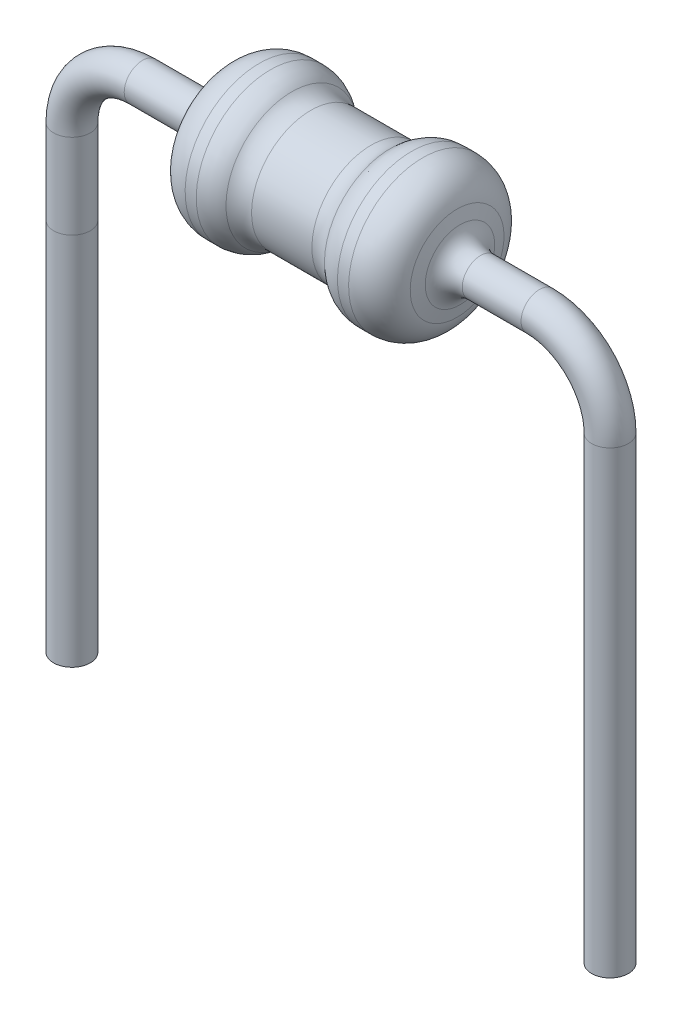
ISO-10303-21;
HEADER;
FILE_DESCRIPTION(('STEP AP214'),'2;1');
FILE_NAME('part.step','',(''),(''),'','','');
FILE_SCHEMA(('AUTOMOTIVE_DESIGN { 1 0 10303 214 1 1 1 1 }'));
ENDSEC;
DATA;
#1=APPLICATION_CONTEXT('core data for automotive mechanical design processes');
#2=APPLICATION_PROTOCOL_DEFINITION('international standard','automotive_design',2000,#1);
#3=PRODUCT_CONTEXT('',#1,'mechanical');
#4=PRODUCT('Part','Part','',(#3));
#5=PRODUCT_RELATED_PRODUCT_CATEGORY('part','',(#4));
#6=PRODUCT_DEFINITION_FORMATION('','',#4);
#7=PRODUCT_DEFINITION_CONTEXT('part definition',#1,'design');
#8=PRODUCT_DEFINITION('design','',#6,#7);
#9=PRODUCT_DEFINITION_SHAPE('','',#8);
#10=(LENGTH_UNIT() NAMED_UNIT(*) SI_UNIT(.MILLI.,.METRE.));
#11=(NAMED_UNIT(*) PLANE_ANGLE_UNIT() SI_UNIT($,.RADIAN.));
#12=(NAMED_UNIT(*) SI_UNIT($,.STERADIAN.) SOLID_ANGLE_UNIT());
#13=UNCERTAINTY_MEASURE_WITH_UNIT(LENGTH_MEASURE(1.E-05),#10,'distance_accuracy_value','');
#14=(GEOMETRIC_REPRESENTATION_CONTEXT(3) GLOBAL_UNCERTAINTY_ASSIGNED_CONTEXT((#13)) GLOBAL_UNIT_ASSIGNED_CONTEXT((#10,
#11,#12)) REPRESENTATION_CONTEXT('',''));
#15=CARTESIAN_POINT('',(0.,0.,0.));
#16=DIRECTION('',(0.,0.,1.));
#17=DIRECTION('',(1.,0.,0.));
#18=AXIS2_PLACEMENT_3D('',#15,#16,#17);
#19=CARTESIAN_POINT('',(-1.8,7.5,0.));
#20=DIRECTION('',(1.,0.,0.));
#21=DIRECTION('',(0.,1.,0.));
#22=AXIS2_PLACEMENT_3D('',#19,#20,#21);
#23=CONICAL_SURFACE('',#22,0.,1.34041265672804);
#24=CARTESIAN_POINT('',(-1.68472085575048,7.5,0.));
#25=DIRECTION('',(-1.,0.,0.));
#26=DIRECTION('',(0.,-1.,0.));
#27=AXIS2_PLACEMENT_3D('',#24,#25,#26);
#28=CIRCLE('',#27,0.491494677980768);
#29=CARTESIAN_POINT('',(-1.68472085575048,7.00850532201923,0.));
#30=VERTEX_POINT('',#29);
#31=EDGE_CURVE('E49',#30,#30,#28,.F.);
#32=ORIENTED_EDGE('',*,*,#31,.T.);
#33=EDGE_LOOP('',(#32));
#34=FACE_BOUND('',#33,.T.);
#35=CARTESIAN_POINT('',(-1.64421888795083,7.5,0.));
#36=DIRECTION('',(-1.,0.,0.));
#37=DIRECTION('',(0.,-1.,0.));
#38=AXIS2_PLACEMENT_3D('',#35,#36,#37);
#39=CIRCLE('',#38,0.66417553669872);
#40=CARTESIAN_POINT('',(-1.64421888795083,6.83582446330128,0.));
#41=VERTEX_POINT('',#40);
#42=EDGE_CURVE('E98',#41,#41,#39,.T.);
#43=ORIENTED_EDGE('',*,*,#42,.T.);
#44=EDGE_LOOP('',(#43));
#45=FACE_BOUND('',#44,.T.);
#46=ADVANCED_FACE('F42',(#34,#45),#23,.T.);
#47=CARTESIAN_POINT('',(2.81,7.5,0.));
#48=DIRECTION('',(-1.,0.,0.));
#49=DIRECTION('',(0.,0.,1.));
#50=AXIS2_PLACEMENT_3D('',#47,#48,#49);
#51=CYLINDRICAL_SURFACE('',#50,0.26);
#52=CARTESIAN_POINT('',(1.97679451230789,7.5,0.));
#53=DIRECTION('',(1.,0.,0.));
#54=DIRECTION('',(0.,1.,0.));
#55=AXIS2_PLACEMENT_3D('',#52,#53,#54);
#56=CIRCLE('',#55,0.26);
#57=CARTESIAN_POINT('',(1.97679451230789,7.76,0.));
#58=VERTEX_POINT('',#57);
#59=EDGE_CURVE('E57',#58,#58,#56,.T.);
#60=ORIENTED_EDGE('',*,*,#59,.T.);
#61=EDGE_LOOP('',(#60));
#62=FACE_BOUND('',#61,.T.);
#63=CARTESIAN_POINT('',(2.81,7.5,0.));
#64=DIRECTION('',(-1.,0.,0.));
#65=DIRECTION('',(0.,0.,1.));
#66=AXIS2_PLACEMENT_3D('',#63,#64,#65);
#67=CIRCLE('',#66,0.26);
#68=CARTESIAN_POINT('',(2.81,7.76,0.));
#69=VERTEX_POINT('',#68);
#70=EDGE_CURVE('E65',#69,#69,#67,.T.);
#71=ORIENTED_EDGE('',*,*,#70,.T.);
#72=EDGE_LOOP('',(#71));
#73=FACE_BOUND('',#72,.T.);
#74=ADVANCED_FACE('F132',(#62,#73),#51,.T.);
#75=CARTESIAN_POINT('',(3.81,5.3,0.));
#76=DIRECTION('',(0.,-1.,0.));
#77=DIRECTION('',(0.,0.,-1.));
#78=AXIS2_PLACEMENT_3D('',#75,#76,#77);
#79=CYLINDRICAL_SURFACE('',#78,0.26);
#80=CARTESIAN_POINT('',(3.81,0.,0.));
#81=DIRECTION('',(0.,1.,0.));
#82=DIRECTION('',(0.,0.,-1.));
#83=AXIS2_PLACEMENT_3D('',#80,#81,#82);
#84=CIRCLE('',#83,0.26);
#85=CARTESIAN_POINT('',(3.81,0.,-0.259999999999999));
#86=VERTEX_POINT('',#85);
#87=EDGE_CURVE('E62',#86,#86,#84,.T.);
#88=ORIENTED_EDGE('',*,*,#87,.T.);
#89=EDGE_LOOP('',(#88));
#90=FACE_BOUND('',#89,.T.);
#91=CARTESIAN_POINT('',(3.81,6.5,0.));
#92=DIRECTION('',(0.,1.,0.));
#93=DIRECTION('',(0.,0.,1.));
#94=AXIS2_PLACEMENT_3D('',#91,#92,#93);
#95=CIRCLE('',#94,0.26);
#96=CARTESIAN_POINT('',(4.07,6.5,0.));
#97=VERTEX_POINT('',#96);
#98=EDGE_CURVE('E68',#97,#97,#95,.T.);
#99=ORIENTED_EDGE('',*,*,#98,.F.);
#100=EDGE_LOOP('',(#99));
#101=FACE_BOUND('',#100,.T.);
#102=ADVANCED_FACE('F136',(#90,#101),#79,.T.);
#103=CARTESIAN_POINT('',(3.81,0.,0.));
#104=DIRECTION('',(0.,-1.,0.));
#105=DIRECTION('',(0.,0.,-1.));
#106=AXIS2_PLACEMENT_3D('',#103,#104,#105);
#107=PLANE('',#106);
#108=ORIENTED_EDGE('',*,*,#87,.F.);
#109=EDGE_LOOP('',(#108));
#110=FACE_BOUND('',#109,.T.);
#111=ADVANCED_FACE('F178',(#110),#107,.T.);
#112=CARTESIAN_POINT('',(2.81,6.5,0.));
#113=DIRECTION('',(0.,0.,1.));
#114=DIRECTION('',(1.,0.,0.));
#115=AXIS2_PLACEMENT_3D('',#112,#113,#114);
#116=TOROIDAL_SURFACE('',#115,1.,0.26);
#117=CARTESIAN_POINT('',(2.81,6.5,0.));
#118=DIRECTION('',(0.,0.,1.));
#119=DIRECTION('',(1.,0.,0.));
#120=AXIS2_PLACEMENT_3D('',#117,#118,#119);
#121=CIRCLE('',#120,1.26);
#122=EDGE_CURVE('',#97,#69,#121,.T.);
#123=ORIENTED_EDGE('',*,*,#98,.T.);
#124=ORIENTED_EDGE('',*,*,#70,.F.);
#125=ORIENTED_EDGE('',*,*,#122,.T.);
#126=ORIENTED_EDGE('',*,*,#122,.F.);
#127=EDGE_LOOP('',(#123,#125,#124,#126));
#128=FACE_BOUND('',#127,.T.);
#129=ADVANCED_FACE('F175',(#128),#116,.T.);
#130=CARTESIAN_POINT('',(1.79999999999961,7.5,0.));
#131=DIRECTION('',(-1.,0.,0.));
#132=DIRECTION('',(0.,-1.,0.));
#133=AXIS2_PLACEMENT_3D('',#130,#131,#132);
#134=CONICAL_SURFACE('',#133,0.,1.34041265672804);
#135=CARTESIAN_POINT('',(1.68472085575009,7.5,0.));
#136=DIRECTION('',(1.,0.,0.));
#137=DIRECTION('',(0.,1.,0.));
#138=AXIS2_PLACEMENT_3D('',#135,#136,#137);
#139=CIRCLE('',#138,0.49149467798077);
#140=CARTESIAN_POINT('',(1.68472085575009,7.99149467798077,0.));
#141=VERTEX_POINT('',#140);
#142=EDGE_CURVE('E53',#141,#141,#139,.F.);
#143=ORIENTED_EDGE('',*,*,#142,.T.);
#144=EDGE_LOOP('',(#143));
#145=FACE_BOUND('',#144,.T.);
#146=CARTESIAN_POINT('',(1.64421888795044,7.5,0.));
#147=DIRECTION('',(-1.,0.,0.));
#148=DIRECTION('',(0.,-1.,0.));
#149=AXIS2_PLACEMENT_3D('',#146,#147,#148);
#150=CIRCLE('',#149,0.664175536698719);
#151=CARTESIAN_POINT('',(1.64421888795044,6.83582446330128,0.));
#152=VERTEX_POINT('',#151);
#153=EDGE_CURVE('E71',#152,#152,#150,.T.);
#154=ORIENTED_EDGE('',*,*,#153,.F.);
#155=EDGE_LOOP('',(#154));
#156=FACE_BOUND('',#155,.T.);
#157=ADVANCED_FACE('F171',(#145,#156),#134,.T.);
#158=CARTESIAN_POINT('',(1.15742946035411,7.5,0.));
#159=DIRECTION('',(-1.,0.,0.));
#160=DIRECTION('',(0.,-1.,0.));
#161=AXIS2_PLACEMENT_3D('',#158,#159,#160);
#162=TOROIDAL_SURFACE('',#161,0.549999999999999,0.500000000000001);
#163=CARTESIAN_POINT('',(1.15742946035411,7.5,0.));
#164=DIRECTION('',(-1.,0.,0.));
#165=DIRECTION('',(0.,-1.,0.));
#166=AXIS2_PLACEMENT_3D('',#163,#164,#165);
#167=CIRCLE('',#166,1.05);
#168=CARTESIAN_POINT('',(1.15742946035411,6.45,0.));
#169=VERTEX_POINT('',#168);
#170=EDGE_CURVE('E74',#169,#169,#167,.T.);
#171=ORIENTED_EDGE('',*,*,#170,.F.);
#172=EDGE_LOOP('',(#171));
#173=FACE_BOUND('',#172,.T.);
#174=ORIENTED_EDGE('',*,*,#153,.T.);
#175=EDGE_LOOP('',(#174));
#176=FACE_BOUND('',#175,.T.);
#177=ADVANCED_FACE('F167',(#173,#176),#162,.T.);
#178=CARTESIAN_POINT('',(-1.8,7.5,0.));
#179=DIRECTION('',(-1.,0.,0.));
#180=DIRECTION('',(0.,-1.,0.));
#181=AXIS2_PLACEMENT_3D('',#178,#179,#180);
#182=CYLINDRICAL_SURFACE('',#181,1.05);
#183=ORIENTED_EDGE('',*,*,#170,.T.);
#184=EDGE_LOOP('',(#183));
#185=FACE_BOUND('',#184,.T.);
#186=CARTESIAN_POINT('',(0.999999999999805,7.5,0.));
#187=DIRECTION('',(-1.,0.,0.));
#188=DIRECTION('',(0.,-1.,0.));
#189=AXIS2_PLACEMENT_3D('',#186,#187,#188);
#190=CIRCLE('',#189,1.05);
#191=CARTESIAN_POINT('',(0.999999999999805,6.45,0.));
#192=VERTEX_POINT('',#191);
#193=EDGE_CURVE('E77',#192,#192,#190,.T.);
#194=ORIENTED_EDGE('',*,*,#193,.F.);
#195=EDGE_LOOP('',(#194));
#196=FACE_BOUND('',#195,.T.);
#197=ADVANCED_FACE('F163',(#185,#196),#182,.T.);
#198=CARTESIAN_POINT('',(0.999999999999804,7.5,0.));
#199=DIRECTION('',(-1.,0.,0.));
#200=DIRECTION('',(0.,-1.,0.));
#201=AXIS2_PLACEMENT_3D('',#198,#199,#200);
#202=TOROIDAL_SURFACE('',#201,0.604283296380693,0.445716703619307);
#203=CARTESIAN_POINT('',(0.697206266015347,7.5,0.));
#204=DIRECTION('',(-1.,0.,0.));
#205=DIRECTION('',(0.,-1.,0.));
#206=AXIS2_PLACEMENT_3D('',#203,#204,#205);
#207=CIRCLE('',#206,0.931360251461619);
#208=CARTESIAN_POINT('',(0.697206266015347,6.56863974853838,0.));
#209=VERTEX_POINT('',#208);
#210=EDGE_CURVE('E80',#209,#209,#207,.T.);
#211=ORIENTED_EDGE('',*,*,#210,.F.);
#212=EDGE_LOOP('',(#211));
#213=FACE_BOUND('',#212,.T.);
#214=ORIENTED_EDGE('',*,*,#193,.T.);
#215=EDGE_LOOP('',(#214));
#216=FACE_BOUND('',#215,.T.);
#217=ADVANCED_FACE('F159',(#213,#216),#202,.T.);
#218=CARTESIAN_POINT('',(0.458425266305661,7.5,0.));
#219=DIRECTION('',(-1.,0.,0.));
#220=DIRECTION('',(0.,-1.,0.));
#221=AXIS2_PLACEMENT_3D('',#218,#219,#220);
#222=TOROIDAL_SURFACE('',#221,1.18929082779327,0.351489043967425);
#223=CARTESIAN_POINT('',(0.427167282613496,7.5,0.));
#224=DIRECTION('',(-1.,0.,0.));
#225=DIRECTION('',(0.,-1.,0.));
#226=AXIS2_PLACEMENT_3D('',#223,#224,#225);
#227=CIRCLE('',#226,0.839194431804059);
#228=CARTESIAN_POINT('',(0.427167282613496,6.66080556819594,0.));
#229=VERTEX_POINT('',#228);
#230=EDGE_CURVE('E83',#229,#229,#227,.T.);
#231=ORIENTED_EDGE('',*,*,#230,.F.);
#232=EDGE_LOOP('',(#231));
#233=FACE_BOUND('',#232,.T.);
#234=ORIENTED_EDGE('',*,*,#210,.T.);
#235=EDGE_LOOP('',(#234));
#236=FACE_BOUND('',#235,.T.);
#237=ADVANCED_FACE('F155',(#233,#236),#222,.F.);
#238=CARTESIAN_POINT('',(-1.8,7.5,0.));
#239=DIRECTION('',(-1.,0.,0.));
#240=DIRECTION('',(0.,-1.,0.));
#241=AXIS2_PLACEMENT_3D('',#238,#239,#240);
#242=CYLINDRICAL_SURFACE('',#241,0.839194431804059);
#243=ORIENTED_EDGE('',*,*,#230,.T.);
#244=EDGE_LOOP('',(#243));
#245=FACE_BOUND('',#244,.T.);
#246=CARTESIAN_POINT('',(-0.427167282613886,7.5,0.));
#247=DIRECTION('',(-1.,0.,0.));
#248=DIRECTION('',(0.,-1.,0.));
#249=AXIS2_PLACEMENT_3D('',#246,#247,#248);
#250=CIRCLE('',#249,0.839194431804059);
#251=CARTESIAN_POINT('',(-0.427167282613886,6.66080556819594,0.));
#252=VERTEX_POINT('',#251);
#253=EDGE_CURVE('E86',#252,#252,#250,.T.);
#254=ORIENTED_EDGE('',*,*,#253,.F.);
#255=EDGE_LOOP('',(#254));
#256=FACE_BOUND('',#255,.T.);
#257=ADVANCED_FACE('F151',(#245,#256),#242,.T.);
#258=CARTESIAN_POINT('',(-0.458425266306051,7.5,0.));
#259=DIRECTION('',(-1.,0.,0.));
#260=DIRECTION('',(0.,-1.,0.));
#261=AXIS2_PLACEMENT_3D('',#258,#259,#260);
#262=TOROIDAL_SURFACE('',#261,1.18929082779327,0.351489043967425);
#263=ORIENTED_EDGE('',*,*,#253,.T.);
#264=EDGE_LOOP('',(#263));
#265=FACE_BOUND('',#264,.T.);
#266=CARTESIAN_POINT('',(-0.697206266015737,7.5,0.));
#267=DIRECTION('',(-1.,0.,0.));
#268=DIRECTION('',(0.,-1.,0.));
#269=AXIS2_PLACEMENT_3D('',#266,#267,#268);
#270=CIRCLE('',#269,0.931360251461619);
#271=CARTESIAN_POINT('',(-0.697206266015736,6.56863974853838,0.));
#272=VERTEX_POINT('',#271);
#273=EDGE_CURVE('E89',#272,#272,#270,.T.);
#274=ORIENTED_EDGE('',*,*,#273,.F.);
#275=EDGE_LOOP('',(#274));
#276=FACE_BOUND('',#275,.T.);
#277=ADVANCED_FACE('F147',(#265,#276),#262,.F.);
#278=CARTESIAN_POINT('',(-1.0000000000002,7.5,0.));
#279=DIRECTION('',(-1.,0.,0.));
#280=DIRECTION('',(0.,-1.,0.));
#281=AXIS2_PLACEMENT_3D('',#278,#279,#280);
#282=TOROIDAL_SURFACE('',#281,0.604283296380693,0.445716703619307);
#283=ORIENTED_EDGE('',*,*,#273,.T.);
#284=EDGE_LOOP('',(#283));
#285=FACE_BOUND('',#284,.T.);
#286=CARTESIAN_POINT('',(-1.00000000000019,7.5,0.));
#287=DIRECTION('',(-1.,0.,0.));
#288=DIRECTION('',(0.,-1.,0.));
#289=AXIS2_PLACEMENT_3D('',#286,#287,#288);
#290=CIRCLE('',#289,1.05);
#291=CARTESIAN_POINT('',(-1.00000000000019,6.45,0.));
#292=VERTEX_POINT('',#291);
#293=EDGE_CURVE('E92',#292,#292,#290,.T.);
#294=ORIENTED_EDGE('',*,*,#293,.F.);
#295=EDGE_LOOP('',(#294));
#296=FACE_BOUND('',#295,.T.);
#297=ADVANCED_FACE('F143',(#285,#296),#282,.T.);
#298=CARTESIAN_POINT('',(-1.8,7.5,0.));
#299=DIRECTION('',(-1.,0.,0.));
#300=DIRECTION('',(0.,-1.,0.));
#301=AXIS2_PLACEMENT_3D('',#298,#299,#300);
#302=CYLINDRICAL_SURFACE('',#301,1.05);
#303=CARTESIAN_POINT('',(-1.1574294603545,7.5,0.));
#304=DIRECTION('',(-1.,0.,0.));
#305=DIRECTION('',(0.,-1.,0.));
#306=AXIS2_PLACEMENT_3D('',#303,#304,#305);
#307=CIRCLE('',#306,1.05);
#308=CARTESIAN_POINT('',(-1.1574294603545,6.45,0.));
#309=VERTEX_POINT('',#308);
#310=EDGE_CURVE('E95',#309,#309,#307,.T.);
#311=ORIENTED_EDGE('',*,*,#310,.F.);
#312=EDGE_LOOP('',(#311));
#313=FACE_BOUND('',#312,.T.);
#314=ORIENTED_EDGE('',*,*,#293,.T.);
#315=EDGE_LOOP('',(#314));
#316=FACE_BOUND('',#315,.T.);
#317=ADVANCED_FACE('F127',(#313,#316),#302,.T.);
#318=CARTESIAN_POINT('',(-1.1574294603545,7.5,0.));
#319=DIRECTION('',(-1.,0.,0.));
#320=DIRECTION('',(0.,-1.,0.));
#321=AXIS2_PLACEMENT_3D('',#318,#319,#320);
#322=TOROIDAL_SURFACE('',#321,0.55,0.500000000000001);
#323=ORIENTED_EDGE('',*,*,#310,.T.);
#324=EDGE_LOOP('',(#323));
#325=FACE_BOUND('',#324,.T.);
#326=ORIENTED_EDGE('',*,*,#42,.F.);
#327=EDGE_LOOP('',(#326));
#328=FACE_BOUND('',#327,.T.);
#329=ADVANCED_FACE('F122',(#325,#328),#322,.T.);
#330=CARTESIAN_POINT('',(-2.81,7.5,0.));
#331=DIRECTION('',(1.,0.,0.));
#332=DIRECTION('',(0.,0.,-1.));
#333=AXIS2_PLACEMENT_3D('',#330,#331,#332);
#334=CYLINDRICAL_SURFACE('',#333,0.26);
#335=CARTESIAN_POINT('',(-1.97679451230828,7.5,0.));
#336=DIRECTION('',(1.,0.,0.));
#337=DIRECTION('',(0.,1.,0.));
#338=AXIS2_PLACEMENT_3D('',#335,#336,#337);
#339=CIRCLE('',#338,0.26);
#340=CARTESIAN_POINT('',(-1.97679451230828,7.76,0.));
#341=VERTEX_POINT('',#340);
#342=EDGE_CURVE('E11',#341,#341,#339,.F.);
#343=ORIENTED_EDGE('',*,*,#342,.T.);
#344=EDGE_LOOP('',(#343));
#345=FACE_BOUND('',#344,.T.);
#346=CARTESIAN_POINT('',(-2.81,7.5,0.));
#347=DIRECTION('',(-1.,0.,0.));
#348=DIRECTION('',(0.,0.,1.));
#349=AXIS2_PLACEMENT_3D('',#346,#347,#348);
#350=CIRCLE('',#349,0.26);
#351=CARTESIAN_POINT('',(-2.81,7.76,0.));
#352=VERTEX_POINT('',#351);
#353=EDGE_CURVE('E101',#352,#352,#350,.T.);
#354=ORIENTED_EDGE('',*,*,#353,.F.);
#355=EDGE_LOOP('',(#354));
#356=FACE_BOUND('',#355,.T.);
#357=ADVANCED_FACE('F117',(#345,#356),#334,.T.);
#358=CARTESIAN_POINT('',(-2.81,6.5,0.));
#359=DIRECTION('',(0.,0.,-1.));
#360=DIRECTION('',(-1.,0.,0.));
#361=AXIS2_PLACEMENT_3D('',#358,#359,#360);
#362=TOROIDAL_SURFACE('',#361,1.,0.26);
#363=CARTESIAN_POINT('',(-3.81,6.5,0.));
#364=DIRECTION('',(0.,-1.,0.));
#365=DIRECTION('',(0.,0.,1.));
#366=AXIS2_PLACEMENT_3D('',#363,#364,#365);
#367=CIRCLE('',#366,0.26);
#368=CARTESIAN_POINT('',(-4.07,6.5,0.));
#369=VERTEX_POINT('',#368);
#370=EDGE_CURVE('E104',#369,#369,#367,.T.);
#371=CARTESIAN_POINT('',(-2.81,6.5,0.));
#372=DIRECTION('',(0.,0.,-1.));
#373=DIRECTION('',(-1.,0.,0.));
#374=AXIS2_PLACEMENT_3D('',#371,#372,#373);
#375=CIRCLE('',#374,1.26);
#376=EDGE_CURVE('',#369,#352,#375,.T.);
#377=ORIENTED_EDGE('',*,*,#370,.F.);
#378=ORIENTED_EDGE('',*,*,#353,.T.);
#379=ORIENTED_EDGE('',*,*,#376,.T.);
#380=ORIENTED_EDGE('',*,*,#376,.F.);
#381=EDGE_LOOP('',(#377,#379,#378,#380));
#382=FACE_BOUND('',#381,.T.);
#383=ADVANCED_FACE('F114',(#382),#362,.T.);
#384=CARTESIAN_POINT('',(-3.81,6.5,0.));
#385=DIRECTION('',(0.,-1.,0.));
#386=DIRECTION('',(1.,0.,0.));
#387=AXIS2_PLACEMENT_3D('',#384,#385,#386);
#388=CYLINDRICAL_SURFACE('',#387,0.26);
#389=ORIENTED_EDGE('',*,*,#370,.T.);
#390=EDGE_LOOP('',(#389));
#391=FACE_BOUND('',#390,.T.);
#392=CARTESIAN_POINT('',(-3.81,5.3,0.));
#393=DIRECTION('',(0.,-1.,0.));
#394=DIRECTION('',(0.,0.,1.));
#395=AXIS2_PLACEMENT_3D('',#392,#393,#394);
#396=CIRCLE('',#395,0.26);
#397=CARTESIAN_POINT('',(-3.81,5.3,0.260000000000001));
#398=VERTEX_POINT('',#397);
#399=EDGE_CURVE('E105',#398,#398,#396,.T.);
#400=ORIENTED_EDGE('',*,*,#399,.F.);
#401=EDGE_LOOP('',(#400));
#402=FACE_BOUND('',#401,.T.);
#403=ADVANCED_FACE('F111',(#391,#402),#388,.T.);
#404=CARTESIAN_POINT('',(-3.81,5.3,0.));
#405=DIRECTION('',(0.,1.,0.));
#406=DIRECTION('',(0.,0.,1.));
#407=AXIS2_PLACEMENT_3D('',#404,#405,#406);
#408=PLANE('',#407);
#409=ORIENTED_EDGE('',*,*,#399,.T.);
#410=EDGE_LOOP('',(#409));
#411=FACE_BOUND('',#410,.T.);
#412=ADVANCED_FACE('F188',(#411),#408,.F.);
#413=CARTESIAN_POINT('',(1.97679451230789,7.5,0.));
#414=DIRECTION('',(1.,0.,0.));
#415=DIRECTION('',(0.,1.,0.));
#416=AXIS2_PLACEMENT_3D('',#413,#414,#415);
#417=TOROIDAL_SURFACE('',#416,0.56,0.3);
#418=ORIENTED_EDGE('',*,*,#142,.F.);
#419=EDGE_LOOP('',(#418));
#420=FACE_BOUND('',#419,.T.);
#421=ORIENTED_EDGE('',*,*,#59,.F.);
#422=EDGE_LOOP('',(#421));
#423=FACE_BOUND('',#422,.T.);
#424=ADVANCED_FACE('F186',(#420,#423),#417,.F.);
#425=CARTESIAN_POINT('',(-1.97679451230828,7.5,0.));
#426=DIRECTION('',(1.,0.,0.));
#427=DIRECTION('',(0.,1.,0.));
#428=AXIS2_PLACEMENT_3D('',#425,#426,#427);
#429=TOROIDAL_SURFACE('',#428,0.559999999999999,0.3);
#430=ORIENTED_EDGE('',*,*,#342,.F.);
#431=EDGE_LOOP('',(#430));
#432=FACE_BOUND('',#431,.T.);
#433=ORIENTED_EDGE('',*,*,#31,.F.);
#434=EDGE_LOOP('',(#433));
#435=FACE_BOUND('',#434,.T.);
#436=ADVANCED_FACE('F44',(#432,#435),#429,.F.);
#437=CLOSED_SHELL('',(#46,#74,#102,#111,#129,#157,#177,#197,#217,#237,#257,#277,#297,#317,#329,
#357,#383,#403,#412,#424,#436));
#438=MANIFOLD_SOLID_BREP('B2',#437);
#439=CARTESIAN_POINT('',(-3.81,5.3,0.));
#440=DIRECTION('',(0.,-1.,0.));
#441=DIRECTION('',(0.,0.,-1.));
#442=AXIS2_PLACEMENT_3D('',#439,#440,#441);
#443=CYLINDRICAL_SURFACE('',#442,0.26);
#444=CARTESIAN_POINT('',(-3.81,5.3,0.));
#445=DIRECTION('',(0.,1.,0.));
#446=DIRECTION('',(0.,0.,1.));
#447=AXIS2_PLACEMENT_3D('',#444,#445,#446);
#448=CIRCLE('',#447,0.26);
#449=CARTESIAN_POINT('',(-3.81,5.3,0.260000000000001));
#450=VERTEX_POINT('',#449);
#451=EDGE_CURVE('E41',#450,#450,#448,.T.);
#452=ORIENTED_EDGE('',*,*,#451,.F.);
#453=EDGE_LOOP('',(#452));
#454=FACE_BOUND('',#453,.T.);
#455=CARTESIAN_POINT('',(-3.81,0.,0.));
#456=DIRECTION('',(0.,1.,0.));
#457=DIRECTION('',(0.,0.,1.));
#458=AXIS2_PLACEMENT_3D('',#455,#456,#457);
#459=CIRCLE('',#458,0.26);
#460=CARTESIAN_POINT('',(-3.81,0.,0.260000000000001));
#461=VERTEX_POINT('',#460);
#462=EDGE_CURVE('E366',#461,#461,#459,.T.);
#463=ORIENTED_EDGE('',*,*,#462,.T.);
#464=EDGE_LOOP('',(#463));
#465=FACE_BOUND('',#464,.T.);
#466=ADVANCED_FACE('F363',(#454,#465),#443,.T.);
#467=CARTESIAN_POINT('',(-3.81,5.3,0.));
#468=DIRECTION('',(0.,1.,0.));
#469=DIRECTION('',(0.,0.,1.));
#470=AXIS2_PLACEMENT_3D('',#467,#468,#469);
#471=PLANE('',#470);
#472=ORIENTED_EDGE('',*,*,#451,.T.);
#473=EDGE_LOOP('',(#472));
#474=FACE_BOUND('',#473,.T.);
#475=ADVANCED_FACE('F378',(#474),#471,.T.);
#476=CARTESIAN_POINT('',(-3.81,0.,0.));
#477=DIRECTION('',(0.,1.,0.));
#478=DIRECTION('',(0.,0.,1.));
#479=AXIS2_PLACEMENT_3D('',#476,#477,#478);
#480=PLANE('',#479);
#481=ORIENTED_EDGE('',*,*,#462,.F.);
#482=EDGE_LOOP('',(#481));
#483=FACE_BOUND('',#482,.T.);
#484=ADVANCED_FACE('F376',(#483),#480,.F.);
#485=CLOSED_SHELL('',(#466,#475,#484));
#486=MANIFOLD_SOLID_BREP('B6',#485);
#487=ADVANCED_BREP_SHAPE_REPRESENTATION('',(#18,#438,#486),#14);
#488=SHAPE_DEFINITION_REPRESENTATION(#9,#487);
ENDSEC;
END-ISO-10303-21;
